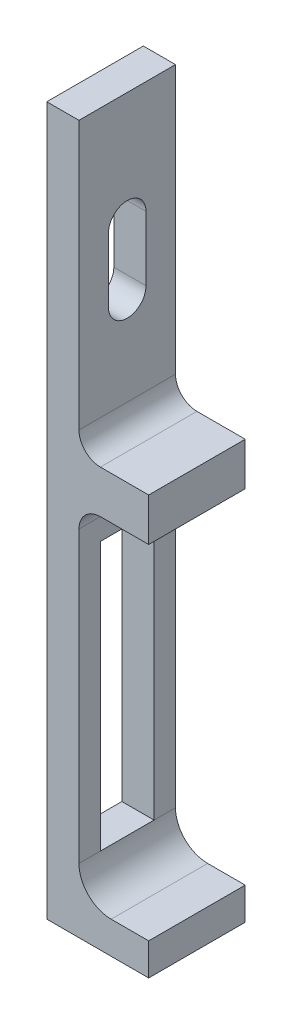
ISO-10303-21;
HEADER;
FILE_DESCRIPTION(('STEP AP214'),'2;1');
FILE_NAME('part.step','',(''),(''),'','','');
FILE_SCHEMA(('AUTOMOTIVE_DESIGN { 1 0 10303 214 1 1 1 1 }'));
ENDSEC;
DATA;
#1=APPLICATION_CONTEXT('core data for automotive mechanical design processes');
#2=APPLICATION_PROTOCOL_DEFINITION('international standard','automotive_design',2000,#1);
#3=PRODUCT_CONTEXT('',#1,'mechanical');
#4=PRODUCT('Part','Part','',(#3));
#5=PRODUCT_RELATED_PRODUCT_CATEGORY('part','',(#4));
#6=PRODUCT_DEFINITION_FORMATION('','',#4);
#7=PRODUCT_DEFINITION_CONTEXT('part definition',#1,'design');
#8=PRODUCT_DEFINITION('design','',#6,#7);
#9=PRODUCT_DEFINITION_SHAPE('','',#8);
#10=(LENGTH_UNIT() NAMED_UNIT(*) SI_UNIT(.MILLI.,.METRE.));
#11=(NAMED_UNIT(*) PLANE_ANGLE_UNIT() SI_UNIT($,.RADIAN.));
#12=(NAMED_UNIT(*) SI_UNIT($,.STERADIAN.) SOLID_ANGLE_UNIT());
#13=UNCERTAINTY_MEASURE_WITH_UNIT(LENGTH_MEASURE(1.E-05),#10,'distance_accuracy_value','');
#14=(GEOMETRIC_REPRESENTATION_CONTEXT(3) GLOBAL_UNCERTAINTY_ASSIGNED_CONTEXT((#13)) GLOBAL_UNIT_ASSIGNED_CONTEXT((#10,
#11,#12)) REPRESENTATION_CONTEXT('',''));
#15=CARTESIAN_POINT('',(0.,0.,0.));
#16=DIRECTION('',(0.,0.,1.));
#17=DIRECTION('',(1.,0.,0.));
#18=AXIS2_PLACEMENT_3D('',#15,#16,#17);
#19=CARTESIAN_POINT('',(3.,3.,9.));
#20=DIRECTION('',(-1.,0.,0.));
#21=DIRECTION('',(0.,0.,1.));
#22=AXIS2_PLACEMENT_3D('',#19,#20,#21);
#23=PLANE('',#22);
#24=DIRECTION('',(0.,1.,0.));
#25=VECTOR('',#24,1.);
#26=CARTESIAN_POINT('',(3.,3.,6.25000000000002));
#27=LINE('',#26,#25);
#28=CARTESIAN_POINT('',(3.,49.52,6.25000000000001));
#29=VERTEX_POINT('',#28);
#30=CARTESIAN_POINT('',(3.,55.52,6.25000000000001));
#31=VERTEX_POINT('',#30);
#32=EDGE_CURVE('E310',#29,#31,#27,.T.);
#33=ORIENTED_EDGE('',*,*,#32,.T.);
#34=CARTESIAN_POINT('',(3.,55.52,4.5));
#35=DIRECTION('',(-1.,0.,0.));
#36=DIRECTION('',(0.,0.,1.));
#37=AXIS2_PLACEMENT_3D('',#34,#35,#36);
#38=CIRCLE('',#37,1.75);
#39=CARTESIAN_POINT('',(3.,55.52,2.75));
#40=VERTEX_POINT('',#39);
#41=EDGE_CURVE('E313',#31,#40,#38,.T.);
#42=ORIENTED_EDGE('',*,*,#41,.T.);
#43=DIRECTION('',(0.,-1.,0.));
#44=VECTOR('',#43,1.);
#45=CARTESIAN_POINT('',(3.,3.,2.75000000000002));
#46=LINE('',#45,#44);
#47=CARTESIAN_POINT('',(3.,49.52,2.75));
#48=VERTEX_POINT('',#47);
#49=EDGE_CURVE('E304',#40,#48,#46,.T.);
#50=ORIENTED_EDGE('',*,*,#49,.T.);
#51=CARTESIAN_POINT('',(3.,49.52,4.50000000000001));
#52=DIRECTION('',(-1.,0.,0.));
#53=DIRECTION('',(0.,0.,1.));
#54=AXIS2_PLACEMENT_3D('',#51,#52,#53);
#55=CIRCLE('',#54,1.75);
#56=EDGE_CURVE('E307',#48,#29,#55,.T.);
#57=ORIENTED_EDGE('',*,*,#56,.T.);
#58=EDGE_LOOP('',(#33,#42,#50,#57));
#59=FACE_BOUND('',#58,.T.);
#60=DIRECTION('',(0.,1.,0.));
#61=VECTOR('',#60,1.);
#62=CARTESIAN_POINT('',(3.,3.,9.));
#63=LINE('',#62,#61);
#64=CARTESIAN_POINT('',(3.,41.,9.));
#65=VERTEX_POINT('',#64);
#66=CARTESIAN_POINT('',(3.,66.,9.));
#67=VERTEX_POINT('',#66);
#68=EDGE_CURVE('E270',#65,#67,#63,.T.);
#69=ORIENTED_EDGE('',*,*,#68,.F.);
#70=DIRECTION('',(0.,0.,1.));
#71=VECTOR('',#70,1.);
#72=CARTESIAN_POINT('',(3.,41.,9.));
#73=LINE('',#72,#71);
#74=CARTESIAN_POINT('',(3.,41.,0.));
#75=VERTEX_POINT('',#74);
#76=EDGE_CURVE('E51',#65,#75,#73,.F.);
#77=ORIENTED_EDGE('',*,*,#76,.T.);
#78=DIRECTION('',(0.,1.,0.));
#79=VECTOR('',#78,1.);
#80=CARTESIAN_POINT('',(3.,3.,0.));
#81=LINE('',#80,#79);
#82=CARTESIAN_POINT('',(3.,66.,0.));
#83=VERTEX_POINT('',#82);
#84=EDGE_CURVE('E285',#75,#83,#81,.T.);
#85=ORIENTED_EDGE('',*,*,#84,.T.);
#86=DIRECTION('',(0.,0.,-1.));
#87=VECTOR('',#86,1.);
#88=CARTESIAN_POINT('',(3.,66.,9.));
#89=LINE('',#88,#87);
#90=EDGE_CURVE('E292',#67,#83,#89,.T.);
#91=ORIENTED_EDGE('',*,*,#90,.F.);
#92=EDGE_LOOP('',(#69,#77,#85,#91));
#93=FACE_BOUND('',#92,.T.);
#94=ADVANCED_FACE('F36',(#59,#93),#23,.F.);
#95=CARTESIAN_POINT('',(0.,66.,9.));
#96=DIRECTION('',(1.,0.,0.));
#97=DIRECTION('',(0.,1.,0.));
#98=AXIS2_PLACEMENT_3D('',#95,#96,#97);
#99=PLANE('',#98);
#100=DIRECTION('',(0.,0.,1.));
#101=VECTOR('',#100,1.);
#102=CARTESIAN_POINT('',(0.,31.,7.));
#103=LINE('',#102,#101);
#104=CARTESIAN_POINT('',(0.,31.,2.00000000000001));
#105=VERTEX_POINT('',#104);
#106=CARTESIAN_POINT('',(0.,31.,7.));
#107=VERTEX_POINT('',#106);
#108=EDGE_CURVE('E215',#105,#107,#103,.T.);
#109=ORIENTED_EDGE('',*,*,#108,.T.);
#110=DIRECTION('',(0.,-1.,0.));
#111=VECTOR('',#110,1.);
#112=CARTESIAN_POINT('',(0.,31.,7.));
#113=LINE('',#112,#111);
#114=CARTESIAN_POINT('',(0.,6.,7.));
#115=VERTEX_POINT('',#114);
#116=EDGE_CURVE('E205',#107,#115,#113,.T.);
#117=ORIENTED_EDGE('',*,*,#116,.T.);
#118=DIRECTION('',(0.,0.,-1.));
#119=VECTOR('',#118,1.);
#120=CARTESIAN_POINT('',(0.,6.,7.));
#121=LINE('',#120,#119);
#122=CARTESIAN_POINT('',(0.,6.,2.00000000000001));
#123=VERTEX_POINT('',#122);
#124=EDGE_CURVE('E208',#115,#123,#121,.T.);
#125=ORIENTED_EDGE('',*,*,#124,.T.);
#126=DIRECTION('',(0.,1.,0.));
#127=VECTOR('',#126,1.);
#128=CARTESIAN_POINT('',(0.,31.,2.00000000000001));
#129=LINE('',#128,#127);
#130=EDGE_CURVE('E212',#123,#105,#129,.T.);
#131=ORIENTED_EDGE('',*,*,#130,.T.);
#132=EDGE_LOOP('',(#109,#117,#125,#131));
#133=FACE_BOUND('',#132,.T.);
#134=DIRECTION('',(0.,-1.,0.));
#135=VECTOR('',#134,1.);
#136=CARTESIAN_POINT('',(0.,55.52,2.75));
#137=LINE('',#136,#135);
#138=CARTESIAN_POINT('',(0.,55.52,2.75));
#139=VERTEX_POINT('',#138);
#140=CARTESIAN_POINT('',(0.,49.52,2.75));
#141=VERTEX_POINT('',#140);
#142=EDGE_CURVE('E241',#139,#141,#137,.T.);
#143=ORIENTED_EDGE('',*,*,#142,.F.);
#144=CARTESIAN_POINT('',(0.,55.52,4.5));
#145=DIRECTION('',(-1.,0.,0.));
#146=DIRECTION('',(0.,-1.,0.));
#147=AXIS2_PLACEMENT_3D('',#144,#145,#146);
#148=CIRCLE('',#147,1.75);
#149=CARTESIAN_POINT('',(0.,55.52,6.25000000000001));
#150=VERTEX_POINT('',#149);
#151=EDGE_CURVE('E233',#150,#139,#148,.T.);
#152=ORIENTED_EDGE('',*,*,#151,.F.);
#153=DIRECTION('',(0.,1.,0.));
#154=VECTOR('',#153,1.);
#155=CARTESIAN_POINT('',(0.,55.52,6.25000000000001));
#156=LINE('',#155,#154);
#157=CARTESIAN_POINT('',(0.,49.52,6.25000000000001));
#158=VERTEX_POINT('',#157);
#159=EDGE_CURVE('E247',#158,#150,#156,.T.);
#160=ORIENTED_EDGE('',*,*,#159,.F.);
#161=CARTESIAN_POINT('',(0.,49.52,4.50000000000001));
#162=DIRECTION('',(-1.,0.,0.));
#163=DIRECTION('',(0.,-1.,0.));
#164=AXIS2_PLACEMENT_3D('',#161,#162,#163);
#165=CIRCLE('',#164,1.75);
#166=EDGE_CURVE('E244',#141,#158,#165,.T.);
#167=ORIENTED_EDGE('',*,*,#166,.F.);
#168=EDGE_LOOP('',(#143,#152,#160,#167));
#169=FACE_BOUND('',#168,.T.);
#170=DIRECTION('',(0.,-1.,0.));
#171=VECTOR('',#170,1.);
#172=CARTESIAN_POINT('',(0.,66.,0.));
#173=LINE('',#172,#171);
#174=CARTESIAN_POINT('',(0.,66.,0.));
#175=VERTEX_POINT('',#174);
#176=CARTESIAN_POINT('',(0.,0.,0.));
#177=VERTEX_POINT('',#176);
#178=EDGE_CURVE('E253',#175,#177,#173,.T.);
#179=ORIENTED_EDGE('',*,*,#178,.T.);
#180=DIRECTION('',(0.,0.,-1.));
#181=VECTOR('',#180,1.);
#182=CARTESIAN_POINT('',(0.,0.,9.));
#183=LINE('',#182,#181);
#184=CARTESIAN_POINT('',(0.,0.,9.));
#185=VERTEX_POINT('',#184);
#186=EDGE_CURVE('E301',#185,#177,#183,.T.);
#187=ORIENTED_EDGE('',*,*,#186,.F.);
#188=DIRECTION('',(0.,-1.,0.));
#189=VECTOR('',#188,1.);
#190=CARTESIAN_POINT('',(0.,66.,9.));
#191=LINE('',#190,#189);
#192=CARTESIAN_POINT('',(0.,66.,9.));
#193=VERTEX_POINT('',#192);
#194=EDGE_CURVE('E260',#193,#185,#191,.T.);
#195=ORIENTED_EDGE('',*,*,#194,.F.);
#196=DIRECTION('',(0.,0.,-1.));
#197=VECTOR('',#196,1.);
#198=CARTESIAN_POINT('',(0.,66.,9.));
#199=LINE('',#198,#197);
#200=EDGE_CURVE('E275',#193,#175,#199,.T.);
#201=ORIENTED_EDGE('',*,*,#200,.T.);
#202=EDGE_LOOP('',(#179,#187,#195,#201));
#203=FACE_BOUND('',#202,.T.);
#204=ADVANCED_FACE('F361',(#133,#169,#203),#99,.F.);
#205=CARTESIAN_POINT('',(0.,0.,9.));
#206=DIRECTION('',(0.,1.,0.));
#207=DIRECTION('',(0.,0.,1.));
#208=AXIS2_PLACEMENT_3D('',#205,#206,#207);
#209=PLANE('',#208);
#210=DIRECTION('',(1.,0.,0.));
#211=VECTOR('',#210,1.);
#212=CARTESIAN_POINT('',(0.,0.,0.));
#213=LINE('',#212,#211);
#214=CARTESIAN_POINT('',(9.5,0.,0.));
#215=VERTEX_POINT('',#214);
#216=EDGE_CURVE('E278',#177,#215,#213,.T.);
#217=ORIENTED_EDGE('',*,*,#216,.T.);
#218=DIRECTION('',(0.,0.,-1.));
#219=VECTOR('',#218,1.);
#220=CARTESIAN_POINT('',(9.5,0.,9.));
#221=LINE('',#220,#219);
#222=CARTESIAN_POINT('',(9.5,0.,9.));
#223=VERTEX_POINT('',#222);
#224=EDGE_CURVE('E298',#223,#215,#221,.T.);
#225=ORIENTED_EDGE('',*,*,#224,.F.);
#226=DIRECTION('',(1.,0.,0.));
#227=VECTOR('',#226,1.);
#228=CARTESIAN_POINT('',(0.,0.,9.));
#229=LINE('',#228,#227);
#230=EDGE_CURVE('E262',#185,#223,#229,.T.);
#231=ORIENTED_EDGE('',*,*,#230,.F.);
#232=ORIENTED_EDGE('',*,*,#186,.T.);
#233=EDGE_LOOP('',(#217,#225,#231,#232));
#234=FACE_BOUND('',#233,.T.);
#235=ADVANCED_FACE('F369',(#234),#209,.F.);
#236=CARTESIAN_POINT('',(9.5,0.,9.));
#237=DIRECTION('',(-1.,0.,0.));
#238=DIRECTION('',(0.,0.,1.));
#239=AXIS2_PLACEMENT_3D('',#236,#237,#238);
#240=PLANE('',#239);
#241=DIRECTION('',(0.,1.,0.));
#242=VECTOR('',#241,1.);
#243=CARTESIAN_POINT('',(9.5,0.,0.));
#244=LINE('',#243,#242);
#245=CARTESIAN_POINT('',(9.5,3.,0.));
#246=VERTEX_POINT('',#245);
#247=EDGE_CURVE('E280',#215,#246,#244,.T.);
#248=ORIENTED_EDGE('',*,*,#247,.T.);
#249=DIRECTION('',(0.,0.,-1.));
#250=VECTOR('',#249,1.);
#251=CARTESIAN_POINT('',(9.5,3.,9.));
#252=LINE('',#251,#250);
#253=CARTESIAN_POINT('',(9.5,3.,9.));
#254=VERTEX_POINT('',#253);
#255=EDGE_CURVE('E295',#254,#246,#252,.T.);
#256=ORIENTED_EDGE('',*,*,#255,.F.);
#257=DIRECTION('',(0.,1.,0.));
#258=VECTOR('',#257,1.);
#259=CARTESIAN_POINT('',(9.5,0.,9.));
#260=LINE('',#259,#258);
#261=EDGE_CURVE('E265',#223,#254,#260,.T.);
#262=ORIENTED_EDGE('',*,*,#261,.F.);
#263=ORIENTED_EDGE('',*,*,#224,.T.);
#264=EDGE_LOOP('',(#248,#256,#262,#263));
#265=FACE_BOUND('',#264,.T.);
#266=ADVANCED_FACE('F382',(#265),#240,.F.);
#267=CARTESIAN_POINT('',(9.5,3.,9.));
#268=DIRECTION('',(0.,-1.,0.));
#269=DIRECTION('',(1.,0.,0.));
#270=AXIS2_PLACEMENT_3D('',#267,#268,#269);
#271=PLANE('',#270);
#272=DIRECTION('',(-1.,0.,0.));
#273=VECTOR('',#272,1.);
#274=CARTESIAN_POINT('',(9.5,3.,0.));
#275=LINE('',#274,#273);
#276=CARTESIAN_POINT('',(6.,3.,0.));
#277=VERTEX_POINT('',#276);
#278=EDGE_CURVE('E282',#246,#277,#275,.T.);
#279=ORIENTED_EDGE('',*,*,#278,.T.);
#280=DIRECTION('',(0.,0.,-1.));
#281=VECTOR('',#280,1.);
#282=CARTESIAN_POINT('',(6.,3.,9.));
#283=LINE('',#282,#281);
#284=CARTESIAN_POINT('',(6.,3.,9.));
#285=VERTEX_POINT('',#284);
#286=EDGE_CURVE('E321',#277,#285,#283,.F.);
#287=ORIENTED_EDGE('',*,*,#286,.T.);
#288=DIRECTION('',(-1.,0.,0.));
#289=VECTOR('',#288,1.);
#290=CARTESIAN_POINT('',(9.5,3.,9.));
#291=LINE('',#290,#289);
#292=EDGE_CURVE('E267',#254,#285,#291,.T.);
#293=ORIENTED_EDGE('',*,*,#292,.F.);
#294=ORIENTED_EDGE('',*,*,#255,.T.);
#295=EDGE_LOOP('',(#279,#287,#293,#294));
#296=FACE_BOUND('',#295,.T.);
#297=ADVANCED_FACE('F375',(#296),#271,.F.);
#298=CARTESIAN_POINT('',(3.,6.,0.));
#299=VERTEX_POINT('',#298);
#300=CARTESIAN_POINT('',(3.,33.,0.));
#301=VERTEX_POINT('',#300);
#302=EDGE_CURVE('E286',#299,#301,#81,.T.);
#303=ORIENTED_EDGE('',*,*,#302,.T.);
#304=DIRECTION('',(0.,0.,1.));
#305=VECTOR('',#304,1.);
#306=CARTESIAN_POINT('',(3.,33.,9.));
#307=LINE('',#306,#305);
#308=CARTESIAN_POINT('',(3.,33.,9.));
#309=VERTEX_POINT('',#308);
#310=EDGE_CURVE('E327',#301,#309,#307,.T.);
#311=ORIENTED_EDGE('',*,*,#310,.T.);
#312=CARTESIAN_POINT('',(3.,6.,9.));
#313=VERTEX_POINT('',#312);
#314=EDGE_CURVE('E271',#313,#309,#63,.T.);
#315=ORIENTED_EDGE('',*,*,#314,.F.);
#316=DIRECTION('',(0.,0.,-1.));
#317=VECTOR('',#316,1.);
#318=CARTESIAN_POINT('',(3.,6.,0.));
#319=LINE('',#318,#317);
#320=CARTESIAN_POINT('',(3.,6.,7.));
#321=VERTEX_POINT('',#320);
#322=EDGE_CURVE('E318',#313,#321,#319,.T.);
#323=ORIENTED_EDGE('',*,*,#322,.T.);
#324=DIRECTION('',(0.,-1.,0.));
#325=VECTOR('',#324,1.);
#326=CARTESIAN_POINT('',(3.,31.,7.));
#327=LINE('',#326,#325);
#328=CARTESIAN_POINT('',(3.,31.,7.));
#329=VERTEX_POINT('',#328);
#330=EDGE_CURVE('E219',#329,#321,#327,.T.);
#331=ORIENTED_EDGE('',*,*,#330,.F.);
#332=DIRECTION('',(0.,0.,1.));
#333=VECTOR('',#332,1.);
#334=CARTESIAN_POINT('',(3.,31.,7.));
#335=LINE('',#334,#333);
#336=CARTESIAN_POINT('',(3.,31.,2.00000000000001));
#337=VERTEX_POINT('',#336);
#338=EDGE_CURVE('E209',#337,#329,#335,.T.);
#339=ORIENTED_EDGE('',*,*,#338,.F.);
#340=DIRECTION('',(0.,1.,0.));
#341=VECTOR('',#340,1.);
#342=CARTESIAN_POINT('',(3.,31.,2.00000000000001));
#343=LINE('',#342,#341);
#344=CARTESIAN_POINT('',(3.,6.,2.00000000000001));
#345=VERTEX_POINT('',#344);
#346=EDGE_CURVE('E226',#345,#337,#343,.T.);
#347=ORIENTED_EDGE('',*,*,#346,.F.);
#348=DIRECTION('',(0.,0.,-1.));
#349=VECTOR('',#348,1.);
#350=CARTESIAN_POINT('',(3.,6.,0.));
#351=LINE('',#350,#349);
#352=EDGE_CURVE('E316',#345,#299,#351,.T.);
#353=ORIENTED_EDGE('',*,*,#352,.T.);
#354=EDGE_LOOP('',(#303,#311,#315,#323,#331,#339,#347,#353));
#355=FACE_BOUND('',#354,.T.);
#356=ADVANCED_FACE('F347',(#355),#23,.F.);
#357=CARTESIAN_POINT('',(3.,66.,9.));
#358=DIRECTION('',(0.,-1.,0.));
#359=DIRECTION('',(0.,0.,-1.));
#360=AXIS2_PLACEMENT_3D('',#357,#358,#359);
#361=PLANE('',#360);
#362=DIRECTION('',(-1.,0.,0.));
#363=VECTOR('',#362,1.);
#364=CARTESIAN_POINT('',(3.,66.,0.));
#365=LINE('',#364,#363);
#366=EDGE_CURVE('E263',#83,#175,#365,.T.);
#367=ORIENTED_EDGE('',*,*,#366,.T.);
#368=ORIENTED_EDGE('',*,*,#200,.F.);
#369=DIRECTION('',(-1.,0.,0.));
#370=VECTOR('',#369,1.);
#371=CARTESIAN_POINT('',(3.,66.,9.));
#372=LINE('',#371,#370);
#373=EDGE_CURVE('E273',#67,#193,#372,.T.);
#374=ORIENTED_EDGE('',*,*,#373,.F.);
#375=ORIENTED_EDGE('',*,*,#90,.T.);
#376=EDGE_LOOP('',(#367,#368,#374,#375));
#377=FACE_BOUND('',#376,.T.);
#378=ADVANCED_FACE('F374',(#377),#361,.F.);
#379=CARTESIAN_POINT('',(0.,0.,9.));
#380=DIRECTION('',(0.,0.,1.));
#381=DIRECTION('',(1.,0.,0.));
#382=AXIS2_PLACEMENT_3D('',#379,#380,#381);
#383=PLANE('',#382);
#384=ORIENTED_EDGE('',*,*,#194,.T.);
#385=ORIENTED_EDGE('',*,*,#230,.T.);
#386=ORIENTED_EDGE('',*,*,#261,.T.);
#387=ORIENTED_EDGE('',*,*,#292,.T.);
#388=CARTESIAN_POINT('',(6.,6.,9.));
#389=DIRECTION('',(0.,0.,1.));
#390=DIRECTION('',(1.,0.,0.));
#391=AXIS2_PLACEMENT_3D('',#388,#389,#390);
#392=CIRCLE('',#391,3.);
#393=EDGE_CURVE('E325',#285,#313,#392,.F.);
#394=ORIENTED_EDGE('',*,*,#393,.T.);
#395=ORIENTED_EDGE('',*,*,#314,.T.);
#396=CARTESIAN_POINT('',(5.,33.,9.));
#397=DIRECTION('',(0.,0.,1.));
#398=DIRECTION('',(1.,0.,0.));
#399=AXIS2_PLACEMENT_3D('',#396,#397,#398);
#400=CIRCLE('',#399,2.);
#401=CARTESIAN_POINT('',(5.,35.,9.));
#402=VERTEX_POINT('',#401);
#403=EDGE_CURVE('E183',#309,#402,#400,.F.);
#404=ORIENTED_EDGE('',*,*,#403,.T.);
#405=DIRECTION('',(1.,0.,0.));
#406=VECTOR('',#405,1.);
#407=CARTESIAN_POINT('',(3.,35.,9.));
#408=LINE('',#407,#406);
#409=CARTESIAN_POINT('',(9.5,35.,9.));
#410=VERTEX_POINT('',#409);
#411=EDGE_CURVE('E176',#402,#410,#408,.T.);
#412=ORIENTED_EDGE('',*,*,#411,.T.);
#413=DIRECTION('',(0.,1.,0.));
#414=VECTOR('',#413,1.);
#415=CARTESIAN_POINT('',(9.5,39.,9.));
#416=LINE('',#415,#414);
#417=CARTESIAN_POINT('',(9.5,39.,9.));
#418=VERTEX_POINT('',#417);
#419=EDGE_CURVE('E181',#410,#418,#416,.T.);
#420=ORIENTED_EDGE('',*,*,#419,.T.);
#421=DIRECTION('',(-1.,0.,0.));
#422=VECTOR('',#421,1.);
#423=CARTESIAN_POINT('',(3.,39.,9.));
#424=LINE('',#423,#422);
#425=CARTESIAN_POINT('',(5.,39.,9.));
#426=VERTEX_POINT('',#425);
#427=EDGE_CURVE('E186',#418,#426,#424,.T.);
#428=ORIENTED_EDGE('',*,*,#427,.T.);
#429=CARTESIAN_POINT('',(5.,41.,9.));
#430=DIRECTION('',(0.,0.,1.));
#431=DIRECTION('',(1.,0.,0.));
#432=AXIS2_PLACEMENT_3D('',#429,#430,#431);
#433=CIRCLE('',#432,2.);
#434=EDGE_CURVE('E44',#426,#65,#433,.F.);
#435=ORIENTED_EDGE('',*,*,#434,.T.);
#436=ORIENTED_EDGE('',*,*,#68,.T.);
#437=ORIENTED_EDGE('',*,*,#373,.T.);
#438=EDGE_LOOP('',(#384,#385,#386,#387,#394,#395,#404,#412,#420,#428,#435,#436,#437));
#439=FACE_BOUND('',#438,.T.);
#440=ADVANCED_FACE('F179',(#439),#383,.T.);
#441=CARTESIAN_POINT('',(0.,0.,0.));
#442=DIRECTION('',(0.,0.,1.));
#443=DIRECTION('',(1.,0.,0.));
#444=AXIS2_PLACEMENT_3D('',#441,#442,#443);
#445=PLANE('',#444);
#446=ORIENTED_EDGE('',*,*,#178,.F.);
#447=ORIENTED_EDGE('',*,*,#366,.F.);
#448=ORIENTED_EDGE('',*,*,#84,.F.);
#449=CARTESIAN_POINT('',(5.,41.,0.));
#450=DIRECTION('',(0.,0.,1.));
#451=DIRECTION('',(1.,0.,0.));
#452=AXIS2_PLACEMENT_3D('',#449,#450,#451);
#453=CIRCLE('',#452,2.);
#454=CARTESIAN_POINT('',(5.,39.,0.));
#455=VERTEX_POINT('',#454);
#456=EDGE_CURVE('E11',#75,#455,#453,.T.);
#457=ORIENTED_EDGE('',*,*,#456,.T.);
#458=DIRECTION('',(1.,0.,0.));
#459=VECTOR('',#458,1.);
#460=CARTESIAN_POINT('',(3.,39.,0.));
#461=LINE('',#460,#459);
#462=CARTESIAN_POINT('',(9.5,39.,0.));
#463=VERTEX_POINT('',#462);
#464=EDGE_CURVE('E223',#455,#463,#461,.T.);
#465=ORIENTED_EDGE('',*,*,#464,.T.);
#466=DIRECTION('',(0.,-1.,0.));
#467=VECTOR('',#466,1.);
#468=CARTESIAN_POINT('',(9.5,39.,0.));
#469=LINE('',#468,#467);
#470=CARTESIAN_POINT('',(9.5,35.,0.));
#471=VERTEX_POINT('',#470);
#472=EDGE_CURVE('E441',#463,#471,#469,.T.);
#473=ORIENTED_EDGE('',*,*,#472,.T.);
#474=DIRECTION('',(-1.,0.,0.));
#475=VECTOR('',#474,1.);
#476=CARTESIAN_POINT('',(3.,35.,0.));
#477=LINE('',#476,#475);
#478=CARTESIAN_POINT('',(5.,35.,0.));
#479=VERTEX_POINT('',#478);
#480=EDGE_CURVE('E193',#471,#479,#477,.T.);
#481=ORIENTED_EDGE('',*,*,#480,.T.);
#482=CARTESIAN_POINT('',(5.,33.,0.));
#483=DIRECTION('',(0.,0.,1.));
#484=DIRECTION('',(1.,0.,0.));
#485=AXIS2_PLACEMENT_3D('',#482,#483,#484);
#486=CIRCLE('',#485,2.);
#487=EDGE_CURVE('E337',#479,#301,#486,.T.);
#488=ORIENTED_EDGE('',*,*,#487,.T.);
#489=ORIENTED_EDGE('',*,*,#302,.F.);
#490=CARTESIAN_POINT('',(6.,6.,0.));
#491=DIRECTION('',(0.,0.,1.));
#492=DIRECTION('',(1.,0.,0.));
#493=AXIS2_PLACEMENT_3D('',#490,#491,#492);
#494=CIRCLE('',#493,3.);
#495=EDGE_CURVE('E323',#299,#277,#494,.T.);
#496=ORIENTED_EDGE('',*,*,#495,.T.);
#497=ORIENTED_EDGE('',*,*,#278,.F.);
#498=ORIENTED_EDGE('',*,*,#247,.F.);
#499=ORIENTED_EDGE('',*,*,#216,.F.);
#500=EDGE_LOOP('',(#446,#447,#448,#457,#465,#473,#481,#488,#489,#496,#497,#498,#499));
#501=FACE_BOUND('',#500,.T.);
#502=ADVANCED_FACE('F342',(#501),#445,.F.);
#503=CARTESIAN_POINT('',(9.5,55.52,4.5));
#504=DIRECTION('',(-1.,0.,0.));
#505=DIRECTION('',(0.,-1.,0.));
#506=AXIS2_PLACEMENT_3D('',#503,#504,#505);
#507=CYLINDRICAL_SURFACE('',#506,1.75);
#508=DIRECTION('',(-1.,0.,0.));
#509=VECTOR('',#508,1.);
#510=CARTESIAN_POINT('',(9.5,55.52,6.25000000000001));
#511=LINE('',#510,#509);
#512=EDGE_CURVE('E251',#31,#150,#511,.T.);
#513=ORIENTED_EDGE('',*,*,#512,.T.);
#514=ORIENTED_EDGE('',*,*,#151,.T.);
#515=DIRECTION('',(-1.,0.,0.));
#516=VECTOR('',#515,1.);
#517=CARTESIAN_POINT('',(9.5,55.52,2.75));
#518=LINE('',#517,#516);
#519=EDGE_CURVE('E250',#40,#139,#518,.T.);
#520=ORIENTED_EDGE('',*,*,#519,.F.);
#521=ORIENTED_EDGE('',*,*,#41,.F.);
#522=EDGE_LOOP('',(#513,#514,#520,#521));
#523=FACE_BOUND('',#522,.T.);
#524=ADVANCED_FACE('F457',(#523),#507,.F.);
#525=CARTESIAN_POINT('',(9.5,55.52,6.25000000000001));
#526=DIRECTION('',(0.,0.,1.));
#527=DIRECTION('',(0.,-1.,0.));
#528=AXIS2_PLACEMENT_3D('',#525,#526,#527);
#529=PLANE('',#528);
#530=DIRECTION('',(-1.,0.,0.));
#531=VECTOR('',#530,1.);
#532=CARTESIAN_POINT('',(9.5,49.52,6.25000000000001));
#533=LINE('',#532,#531);
#534=EDGE_CURVE('E254',#29,#158,#533,.T.);
#535=ORIENTED_EDGE('',*,*,#534,.T.);
#536=ORIENTED_EDGE('',*,*,#159,.T.);
#537=ORIENTED_EDGE('',*,*,#512,.F.);
#538=ORIENTED_EDGE('',*,*,#32,.F.);
#539=EDGE_LOOP('',(#535,#536,#537,#538));
#540=FACE_BOUND('',#539,.T.);
#541=ADVANCED_FACE('F453',(#540),#529,.F.);
#542=CARTESIAN_POINT('',(9.5,49.52,4.50000000000001));
#543=DIRECTION('',(-1.,0.,0.));
#544=DIRECTION('',(0.,-1.,0.));
#545=AXIS2_PLACEMENT_3D('',#542,#543,#544);
#546=CYLINDRICAL_SURFACE('',#545,1.75);
#547=DIRECTION('',(-1.,0.,0.));
#548=VECTOR('',#547,1.);
#549=CARTESIAN_POINT('',(9.5,49.52,2.75));
#550=LINE('',#549,#548);
#551=EDGE_CURVE('E256',#48,#141,#550,.T.);
#552=ORIENTED_EDGE('',*,*,#551,.T.);
#553=ORIENTED_EDGE('',*,*,#166,.T.);
#554=ORIENTED_EDGE('',*,*,#534,.F.);
#555=ORIENTED_EDGE('',*,*,#56,.F.);
#556=EDGE_LOOP('',(#552,#553,#554,#555));
#557=FACE_BOUND('',#556,.T.);
#558=ADVANCED_FACE('F456',(#557),#546,.F.);
#559=CARTESIAN_POINT('',(9.5,55.52,2.75));
#560=DIRECTION('',(0.,0.,-1.));
#561=DIRECTION('',(0.,1.,0.));
#562=AXIS2_PLACEMENT_3D('',#559,#560,#561);
#563=PLANE('',#562);
#564=ORIENTED_EDGE('',*,*,#519,.T.);
#565=ORIENTED_EDGE('',*,*,#142,.T.);
#566=ORIENTED_EDGE('',*,*,#551,.F.);
#567=ORIENTED_EDGE('',*,*,#49,.F.);
#568=EDGE_LOOP('',(#564,#565,#566,#567));
#569=FACE_BOUND('',#568,.T.);
#570=ADVANCED_FACE('F452',(#569),#563,.F.);
#571=CARTESIAN_POINT('',(0.,31.,7.));
#572=DIRECTION('',(0.,0.,1.));
#573=DIRECTION('',(0.,-1.,0.));
#574=AXIS2_PLACEMENT_3D('',#571,#572,#573);
#575=PLANE('',#574);
#576=ORIENTED_EDGE('',*,*,#330,.T.);
#577=DIRECTION('',(1.,0.,0.));
#578=VECTOR('',#577,1.);
#579=CARTESIAN_POINT('',(0.,6.,7.));
#580=LINE('',#579,#578);
#581=EDGE_CURVE('E218',#115,#321,#580,.T.);
#582=ORIENTED_EDGE('',*,*,#581,.F.);
#583=ORIENTED_EDGE('',*,*,#116,.F.);
#584=DIRECTION('',(1.,0.,0.));
#585=VECTOR('',#584,1.);
#586=CARTESIAN_POINT('',(0.,31.,7.));
#587=LINE('',#586,#585);
#588=EDGE_CURVE('E231',#107,#329,#587,.T.);
#589=ORIENTED_EDGE('',*,*,#588,.T.);
#590=EDGE_LOOP('',(#576,#582,#583,#589));
#591=FACE_BOUND('',#590,.T.);
#592=ADVANCED_FACE('F415',(#591),#575,.F.);
#593=CARTESIAN_POINT('',(0.,31.,7.));
#594=DIRECTION('',(0.,1.,0.));
#595=DIRECTION('',(0.,0.,1.));
#596=AXIS2_PLACEMENT_3D('',#593,#594,#595);
#597=PLANE('',#596);
#598=ORIENTED_EDGE('',*,*,#338,.T.);
#599=ORIENTED_EDGE('',*,*,#588,.F.);
#600=ORIENTED_EDGE('',*,*,#108,.F.);
#601=DIRECTION('',(1.,0.,0.));
#602=VECTOR('',#601,1.);
#603=CARTESIAN_POINT('',(0.,31.,2.00000000000001));
#604=LINE('',#603,#602);
#605=EDGE_CURVE('E234',#105,#337,#604,.T.);
#606=ORIENTED_EDGE('',*,*,#605,.T.);
#607=EDGE_LOOP('',(#598,#599,#600,#606));
#608=FACE_BOUND('',#607,.T.);
#609=ADVANCED_FACE('F422',(#608),#597,.F.);
#610=CARTESIAN_POINT('',(0.,31.,2.00000000000001));
#611=DIRECTION('',(0.,0.,-1.));
#612=DIRECTION('',(0.,1.,0.));
#613=AXIS2_PLACEMENT_3D('',#610,#611,#612);
#614=PLANE('',#613);
#615=ORIENTED_EDGE('',*,*,#346,.T.);
#616=ORIENTED_EDGE('',*,*,#605,.F.);
#617=ORIENTED_EDGE('',*,*,#130,.F.);
#618=DIRECTION('',(1.,0.,0.));
#619=VECTOR('',#618,1.);
#620=CARTESIAN_POINT('',(0.,6.,2.00000000000001));
#621=LINE('',#620,#619);
#622=EDGE_CURVE('E236',#123,#345,#621,.T.);
#623=ORIENTED_EDGE('',*,*,#622,.T.);
#624=EDGE_LOOP('',(#615,#616,#617,#623));
#625=FACE_BOUND('',#624,.T.);
#626=ADVANCED_FACE('F405',(#625),#614,.F.);
#627=CARTESIAN_POINT('',(0.,6.,7.));
#628=DIRECTION('',(0.,-1.,0.));
#629=DIRECTION('',(0.,0.,-1.));
#630=AXIS2_PLACEMENT_3D('',#627,#628,#629);
#631=PLANE('',#630);
#632=DIRECTION('',(0.,0.,-1.));
#633=VECTOR('',#632,1.);
#634=CARTESIAN_POINT('',(3.,6.,7.));
#635=LINE('',#634,#633);
#636=EDGE_CURVE('E222',#321,#345,#635,.T.);
#637=ORIENTED_EDGE('',*,*,#636,.T.);
#638=ORIENTED_EDGE('',*,*,#622,.F.);
#639=ORIENTED_EDGE('',*,*,#124,.F.);
#640=ORIENTED_EDGE('',*,*,#581,.T.);
#641=EDGE_LOOP('',(#637,#638,#639,#640));
#642=FACE_BOUND('',#641,.T.);
#643=ADVANCED_FACE('F397',(#642),#631,.F.);
#644=CARTESIAN_POINT('',(6.,6.,9.));
#645=DIRECTION('',(0.,0.,1.));
#646=DIRECTION('',(1.,0.,0.));
#647=AXIS2_PLACEMENT_3D('',#644,#645,#646);
#648=CYLINDRICAL_SURFACE('',#647,3.);
#649=ORIENTED_EDGE('',*,*,#393,.F.);
#650=ORIENTED_EDGE('',*,*,#286,.F.);
#651=ORIENTED_EDGE('',*,*,#495,.F.);
#652=ORIENTED_EDGE('',*,*,#352,.F.);
#653=ORIENTED_EDGE('',*,*,#636,.F.);
#654=ORIENTED_EDGE('',*,*,#322,.F.);
#655=EDGE_LOOP('',(#649,#650,#651,#652,#653,#654));
#656=FACE_BOUND('',#655,.T.);
#657=ADVANCED_FACE('F394',(#656),#648,.F.);
#658=CARTESIAN_POINT('',(3.,39.,-7.63216876123688));
#659=DIRECTION('',(0.,1.,0.));
#660=DIRECTION('',(0.,0.,1.));
#661=AXIS2_PLACEMENT_3D('',#658,#659,#660);
#662=PLANE('',#661);
#663=ORIENTED_EDGE('',*,*,#464,.F.);
#664=DIRECTION('',(0.,0.,1.));
#665=VECTOR('',#664,1.);
#666=CARTESIAN_POINT('',(5.,39.,-7.63216876123688));
#667=LINE('',#666,#665);
#668=EDGE_CURVE('E332',#455,#426,#667,.T.);
#669=ORIENTED_EDGE('',*,*,#668,.T.);
#670=ORIENTED_EDGE('',*,*,#427,.F.);
#671=DIRECTION('',(0.,0.,1.));
#672=VECTOR('',#671,1.);
#673=CARTESIAN_POINT('',(9.5,39.,-7.63216876123688));
#674=LINE('',#673,#672);
#675=EDGE_CURVE('E196',#463,#418,#674,.T.);
#676=ORIENTED_EDGE('',*,*,#675,.F.);
#677=EDGE_LOOP('',(#663,#669,#670,#676));
#678=FACE_BOUND('',#677,.T.);
#679=ADVANCED_FACE('F396',(#678),#662,.T.);
#680=CARTESIAN_POINT('',(9.5,39.,-7.63216876123688));
#681=DIRECTION('',(1.,0.,0.));
#682=DIRECTION('',(0.,0.,-1.));
#683=AXIS2_PLACEMENT_3D('',#680,#681,#682);
#684=PLANE('',#683);
#685=ORIENTED_EDGE('',*,*,#472,.F.);
#686=ORIENTED_EDGE('',*,*,#675,.T.);
#687=ORIENTED_EDGE('',*,*,#419,.F.);
#688=DIRECTION('',(0.,0.,1.));
#689=VECTOR('',#688,1.);
#690=CARTESIAN_POINT('',(9.5,35.,-7.63216876123688));
#691=LINE('',#690,#689);
#692=EDGE_CURVE('E190',#471,#410,#691,.T.);
#693=ORIENTED_EDGE('',*,*,#692,.F.);
#694=EDGE_LOOP('',(#685,#686,#687,#693));
#695=FACE_BOUND('',#694,.T.);
#696=ADVANCED_FACE('F198',(#695),#684,.T.);
#697=CARTESIAN_POINT('',(3.,35.,-7.63216876123688));
#698=DIRECTION('',(0.,-1.,0.));
#699=DIRECTION('',(0.,0.,-1.));
#700=AXIS2_PLACEMENT_3D('',#697,#698,#699);
#701=PLANE('',#700);
#702=ORIENTED_EDGE('',*,*,#411,.F.);
#703=DIRECTION('',(0.,0.,1.));
#704=VECTOR('',#703,1.);
#705=CARTESIAN_POINT('',(5.,35.,-7.63216876123688));
#706=LINE('',#705,#704);
#707=EDGE_CURVE('E330',#402,#479,#706,.F.);
#708=ORIENTED_EDGE('',*,*,#707,.T.);
#709=ORIENTED_EDGE('',*,*,#480,.F.);
#710=ORIENTED_EDGE('',*,*,#692,.T.);
#711=EDGE_LOOP('',(#702,#708,#709,#710));
#712=FACE_BOUND('',#711,.T.);
#713=ADVANCED_FACE('F191',(#712),#701,.T.);
#714=CARTESIAN_POINT('',(5.,33.,9.));
#715=DIRECTION('',(0.,0.,1.));
#716=DIRECTION('',(1.,0.,0.));
#717=AXIS2_PLACEMENT_3D('',#714,#715,#716);
#718=CYLINDRICAL_SURFACE('',#717,2.);
#719=ORIENTED_EDGE('',*,*,#487,.F.);
#720=ORIENTED_EDGE('',*,*,#707,.F.);
#721=ORIENTED_EDGE('',*,*,#403,.F.);
#722=ORIENTED_EDGE('',*,*,#310,.F.);
#723=EDGE_LOOP('',(#719,#720,#721,#722));
#724=FACE_BOUND('',#723,.T.);
#725=ADVANCED_FACE('F351',(#724),#718,.F.);
#726=CARTESIAN_POINT('',(5.,41.,-7.63216876123688));
#727=DIRECTION('',(0.,0.,1.));
#728=DIRECTION('',(1.,0.,0.));
#729=AXIS2_PLACEMENT_3D('',#726,#727,#728);
#730=CYLINDRICAL_SURFACE('',#729,2.);
#731=ORIENTED_EDGE('',*,*,#456,.F.);
#732=ORIENTED_EDGE('',*,*,#76,.F.);
#733=ORIENTED_EDGE('',*,*,#434,.F.);
#734=ORIENTED_EDGE('',*,*,#668,.F.);
#735=EDGE_LOOP('',(#731,#732,#733,#734));
#736=FACE_BOUND('',#735,.T.);
#737=ADVANCED_FACE('F38',(#736),#730,.F.);
#738=CLOSED_SHELL('',(#94,#204,#235,#266,#297,#356,#378,#440,#502,#524,#541,#558,#570,#592,#609,
#626,#643,#657,#679,#696,#713,#725,#737));
#739=MANIFOLD_SOLID_BREP('B2',#738);
#740=ADVANCED_BREP_SHAPE_REPRESENTATION('',(#18,#739),#14);
#741=SHAPE_DEFINITION_REPRESENTATION(#9,#740);
ENDSEC;
END-ISO-10303-21;
